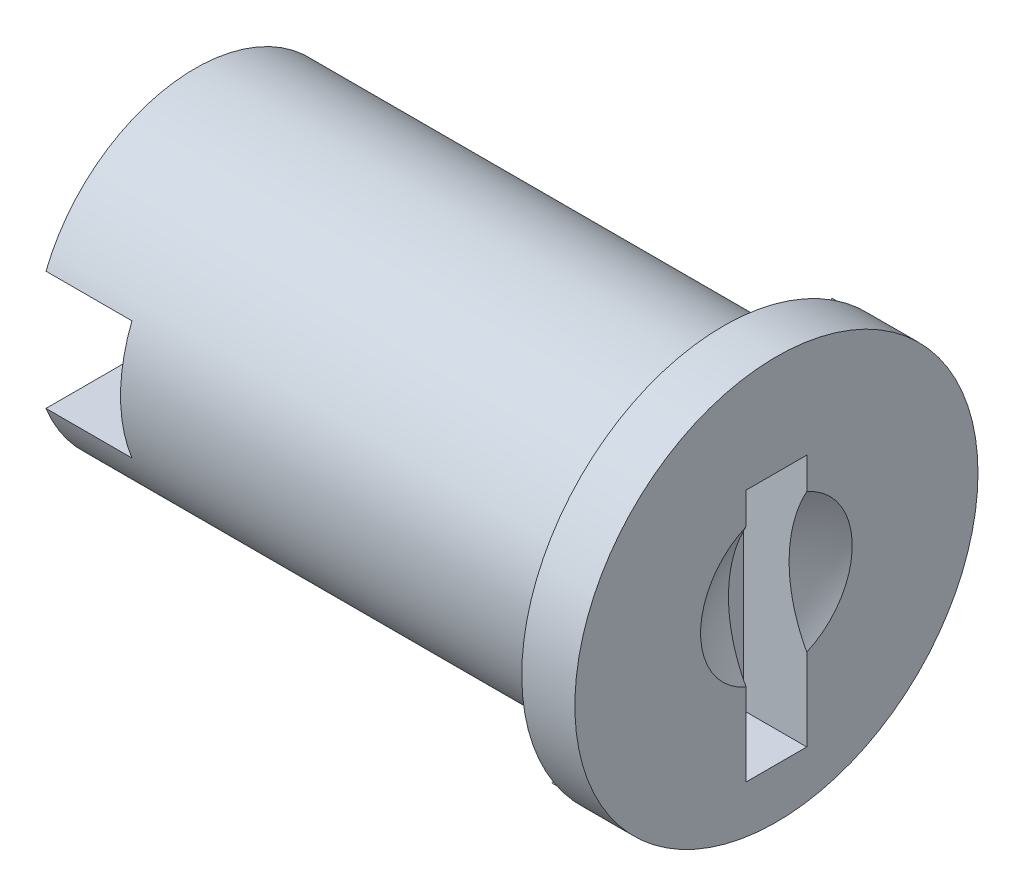
ISO-10303-21;
HEADER;
FILE_DESCRIPTION(('STEP AP214'),'2;1');
FILE_NAME('part.step','',(''),(''),'','','');
FILE_SCHEMA(('AUTOMOTIVE_DESIGN { 1 0 10303 214 1 1 1 1 }'));
ENDSEC;
DATA;
#1=APPLICATION_CONTEXT('core data for automotive mechanical design processes');
#2=APPLICATION_PROTOCOL_DEFINITION('international standard','automotive_design',2000,#1);
#3=PRODUCT_CONTEXT('',#1,'mechanical');
#4=PRODUCT('Part','Part','',(#3));
#5=PRODUCT_RELATED_PRODUCT_CATEGORY('part','',(#4));
#6=PRODUCT_DEFINITION_FORMATION('','',#4);
#7=PRODUCT_DEFINITION_CONTEXT('part definition',#1,'design');
#8=PRODUCT_DEFINITION('design','',#6,#7);
#9=PRODUCT_DEFINITION_SHAPE('','',#8);
#10=(LENGTH_UNIT() NAMED_UNIT(*) SI_UNIT(.MILLI.,.METRE.));
#11=(NAMED_UNIT(*) PLANE_ANGLE_UNIT() SI_UNIT($,.RADIAN.));
#12=(NAMED_UNIT(*) SI_UNIT($,.STERADIAN.) SOLID_ANGLE_UNIT());
#13=UNCERTAINTY_MEASURE_WITH_UNIT(LENGTH_MEASURE(1.E-05),#10,'distance_accuracy_value','');
#14=(GEOMETRIC_REPRESENTATION_CONTEXT(3) GLOBAL_UNCERTAINTY_ASSIGNED_CONTEXT((#13)) GLOBAL_UNIT_ASSIGNED_CONTEXT((#10,
#11,#12)) REPRESENTATION_CONTEXT('',''));
#15=CARTESIAN_POINT('',(0.,0.,0.));
#16=DIRECTION('',(0.,0.,1.));
#17=DIRECTION('',(1.,0.,0.));
#18=AXIS2_PLACEMENT_3D('',#15,#16,#17);
#19=CARTESIAN_POINT('',(61.725000000001,228.297576972466,13.339999964647));
#20=DIRECTION('',(-1.,0.,0.));
#21=DIRECTION('',(0.,0.,1.));
#22=AXIS2_PLACEMENT_3D('',#19,#20,#21);
#23=PLANE('',#22);
#24=DIRECTION('',(0.,0.,-1.));
#25=VECTOR('',#24,1.);
#26=CARTESIAN_POINT('',(61.725000000001,218.047577389513,13.4));
#27=LINE('',#26,#25);
#28=CARTESIAN_POINT('',(61.725000000001,218.047577389513,15.8));
#29=VERTEX_POINT('',#28);
#30=CARTESIAN_POINT('',(61.725000000001,218.047577389513,13.4));
#31=VERTEX_POINT('',#30);
#32=EDGE_CURVE('E281',#29,#31,#27,.T.);
#33=ORIENTED_EDGE('',*,*,#32,.T.);
#34=DIRECTION('',(0.,1.,0.));
#35=VECTOR('',#34,1.);
#36=CARTESIAN_POINT('',(61.725000000001,228.047577389513,13.4));
#37=LINE('',#36,#35);
#38=CARTESIAN_POINT('',(61.725000000001,228.047577389513,13.4));
#39=VERTEX_POINT('',#38);
#40=EDGE_CURVE('E136',#31,#39,#37,.T.);
#41=ORIENTED_EDGE('',*,*,#40,.T.);
#42=DIRECTION('',(0.,0.,1.));
#43=VECTOR('',#42,1.);
#44=CARTESIAN_POINT('',(61.725000000001,228.047577389513,15.8));
#45=LINE('',#44,#43);
#46=CARTESIAN_POINT('',(61.725000000001,228.047577389513,15.8));
#47=VERTEX_POINT('',#46);
#48=EDGE_CURVE('E135',#39,#47,#45,.T.);
#49=ORIENTED_EDGE('',*,*,#48,.T.);
#50=DIRECTION('',(0.,1.,0.));
#51=VECTOR('',#50,1.);
#52=CARTESIAN_POINT('',(61.725000000001,218.047577389513,15.8));
#53=LINE('',#52,#51);
#54=EDGE_CURVE('E123',#47,#29,#53,.F.);
#55=ORIENTED_EDGE('',*,*,#54,.T.);
#56=EDGE_LOOP('',(#33,#41,#49,#55));
#57=FACE_BOUND('',#56,.T.);
#58=ADVANCED_FACE('F15',(#57),#23,.F.);
#59=CARTESIAN_POINT('',(64.225000000001,218.047577389513,15.8));
#60=DIRECTION('',(0.,0.,1.));
#61=DIRECTION('',(1.,0.,0.));
#62=AXIS2_PLACEMENT_3D('',#59,#60,#61);
#63=PLANE('',#62);
#64=ORIENTED_EDGE('',*,*,#54,.F.);
#65=DIRECTION('',(1.,0.,0.));
#66=VECTOR('',#65,1.);
#67=CARTESIAN_POINT('',(64.225000000001,228.047577389513,15.8));
#68=LINE('',#67,#66);
#69=CARTESIAN_POINT('',(64.225000000001,228.047577389513,15.8));
#70=VERTEX_POINT('',#69);
#71=EDGE_CURVE('E127',#47,#70,#68,.T.);
#72=ORIENTED_EDGE('',*,*,#71,.T.);
#73=DIRECTION('',(0.,1.,0.));
#74=VECTOR('',#73,1.);
#75=CARTESIAN_POINT('',(64.225000000001,218.047577389513,15.8));
#76=LINE('',#75,#74);
#77=CARTESIAN_POINT('',(64.225000000001,226.797122806485,15.8));
#78=VERTEX_POINT('',#77);
#79=EDGE_CURVE('E97',#78,#70,#76,.T.);
#80=ORIENTED_EDGE('',*,*,#79,.F.);
#81=CARTESIAN_POINT('',(64.225000000001,226.797122806485,15.8));
#82=CARTESIAN_POINT('',(64.1476260516862,226.654266906512,15.8));
#83=CARTESIAN_POINT('',(64.0763126344508,226.508132131895,15.8));
#84=CARTESIAN_POINT('',(63.9462470484049,226.210382969737,15.8));
#85=CARTESIAN_POINT('',(63.8874943173034,226.05876882784,15.8));
#86=CARTESIAN_POINT('',(63.7830562351237,225.751340828581,15.8));
#87=CARTESIAN_POINT('',(63.7373527555412,225.595533129826,15.8));
#88=CARTESIAN_POINT('',(63.6592239316829,225.280626356045,15.8));
#89=CARTESIAN_POINT('',(63.6267983631208,225.121527336663,15.8));
#90=CARTESIAN_POINT('',(63.5754413767709,224.801074240794,15.8));
#91=CARTESIAN_POINT('',(63.5565175543076,224.639718947006,15.8));
#92=CARTESIAN_POINT('',(63.5323223458392,224.315913378693,15.8));
#93=CARTESIAN_POINT('',(63.5270572244651,224.153462635972,15.8));
#94=CARTESIAN_POINT('',(63.5302346401712,223.828716941676,15.8));
#95=CARTESIAN_POINT('',(63.5386754064599,223.666421972688,15.8));
#96=CARTESIAN_POINT('',(63.5691947373494,223.3431945374,15.8));
#97=CARTESIAN_POINT('',(63.5912668327526,223.182261461474,15.8));
#98=CARTESIAN_POINT('',(63.6472101218361,222.872111604443,15.8));
#99=CARTESIAN_POINT('',(63.6803215481411,222.722757224128,15.8));
#100=CARTESIAN_POINT('',(63.7582867523674,222.427149176738,15.8));
#101=CARTESIAN_POINT('',(63.8031400731256,222.280895389183,15.8));
#102=CARTESIAN_POINT('',(63.904361618914,221.992263818947,15.8));
#103=CARTESIAN_POINT('',(63.9607413764862,221.849890081331,15.8));
#104=CARTESIAN_POINT('',(64.0846222899037,221.570052183648,15.8));
#105=CARTESIAN_POINT('',(64.1521243788181,221.432588436666,15.8));
#106=CARTESIAN_POINT('',(64.225000000001,221.29803197254,15.8));
#107=B_SPLINE_CURVE_WITH_KNOTS('',3,(#81,#82,#83,#84,#85,#86,#87,#88,#89,#90,#91,#92,#93,#94,
#95,#96,#97,#98,#99,#100,#101,#102,#103,#104,#105,#106),.UNSPECIFIED.,.F.,.F.,(4,2,2,2,2,2,2,2,
2,2,2,2,4),(0.,0.487243090755689,0.974464365040759,1.4610054429311,1.94753830198386,
2.43434464177392,2.9213742182606,3.40834087585714,3.89507660474472,4.35354203632693,
4.81198962050202,5.27089815982529,5.72984521729627),.UNSPECIFIED.);
#108=CARTESIAN_POINT('',(64.225000000001,221.29803197254,15.8));
#109=VERTEX_POINT('',#108);
#110=EDGE_CURVE('E18',#78,#109,#107,.T.);
#111=ORIENTED_EDGE('',*,*,#110,.T.);
#112=DIRECTION('',(0.,1.,0.));
#113=VECTOR('',#112,1.);
#114=CARTESIAN_POINT('',(64.225000000001,232.421326998804,15.8));
#115=LINE('',#114,#113);
#116=CARTESIAN_POINT('',(64.225000000001,218.047577389513,15.8));
#117=VERTEX_POINT('',#116);
#118=EDGE_CURVE('E106',#117,#109,#115,.T.);
#119=ORIENTED_EDGE('',*,*,#118,.F.);
#120=DIRECTION('',(1.,0.,0.));
#121=VECTOR('',#120,1.);
#122=CARTESIAN_POINT('',(64.225000000001,218.047577389513,15.8));
#123=LINE('',#122,#121);
#124=EDGE_CURVE('E129',#117,#29,#123,.F.);
#125=ORIENTED_EDGE('',*,*,#124,.T.);
#126=EDGE_LOOP('',(#64,#72,#80,#111,#119,#125));
#127=FACE_BOUND('',#126,.T.);
#128=ADVANCED_FACE('F125',(#127),#63,.F.);
#129=CARTESIAN_POINT('',(69.3028048780479,224.047577389513,14.6));
#130=DIRECTION('',(1.,0.,0.));
#131=DIRECTION('',(0.,1.,0.));
#132=AXIS2_PLACEMENT_3D('',#129,#130,#131);
#133=SPHERICAL_SURFACE('',#132,5.89780487804667);
#134=ORIENTED_EDGE('',*,*,#110,.F.);
#135=CARTESIAN_POINT('',(64.225000000001,224.047577389513,14.6));
#136=DIRECTION('',(1.,0.,0.));
#137=DIRECTION('',(0.,0.,-1.));
#138=AXIS2_PLACEMENT_3D('',#135,#136,#137);
#139=CIRCLE('',#138,2.99999999999914);
#140=EDGE_CURVE('E233',#109,#78,#139,.F.);
#141=ORIENTED_EDGE('',*,*,#140,.F.);
#142=EDGE_LOOP('',(#134,#141));
#143=FACE_BOUND('',#142,.T.);
#144=ADVANCED_FACE('F154',(#143),#133,.F.);
#145=CARTESIAN_POINT('',(64.225000000001,228.047577389513,15.8));
#146=DIRECTION('',(0.,1.,0.));
#147=DIRECTION('',(0.,0.,1.));
#148=AXIS2_PLACEMENT_3D('',#145,#146,#147);
#149=PLANE('',#148);
#150=DIRECTION('',(-1.,0.,0.));
#151=VECTOR('',#150,1.);
#152=CARTESIAN_POINT('',(64.225000000001,228.047577389513,13.4));
#153=LINE('',#152,#151);
#154=CARTESIAN_POINT('',(64.225000000001,228.047577389513,13.4));
#155=VERTEX_POINT('',#154);
#156=EDGE_CURVE('E278',#39,#155,#153,.F.);
#157=ORIENTED_EDGE('',*,*,#156,.T.);
#158=DIRECTION('',(0.,0.,-1.));
#159=VECTOR('',#158,1.);
#160=CARTESIAN_POINT('',(64.225000000001,228.047577389513,22.9737498044968));
#161=LINE('',#160,#159);
#162=EDGE_CURVE('E143',#70,#155,#161,.T.);
#163=ORIENTED_EDGE('',*,*,#162,.F.);
#164=ORIENTED_EDGE('',*,*,#71,.F.);
#165=ORIENTED_EDGE('',*,*,#48,.F.);
#166=EDGE_LOOP('',(#157,#163,#164,#165));
#167=FACE_BOUND('',#166,.T.);
#168=ADVANCED_FACE('F141',(#167),#149,.F.);
#169=CARTESIAN_POINT('',(69.3028048780479,224.047577389513,14.6));
#170=DIRECTION('',(1.,0.,0.));
#171=DIRECTION('',(0.,1.,0.));
#172=AXIS2_PLACEMENT_3D('',#169,#170,#171);
#173=SPHERICAL_SURFACE('',#172,5.89780487804667);
#174=CARTESIAN_POINT('',(64.225000000001,226.797122806485,13.4));
#175=CARTESIAN_POINT('',(64.1476260516861,226.654266906512,13.4));
#176=CARTESIAN_POINT('',(64.0763126344507,226.508132131895,13.4));
#177=CARTESIAN_POINT('',(63.9462470484049,226.210382969737,13.4));
#178=CARTESIAN_POINT('',(63.8874943173034,226.05876882784,13.4));
#179=CARTESIAN_POINT('',(63.7830562351237,225.751340828581,13.4));
#180=CARTESIAN_POINT('',(63.7373527555412,225.595533129826,13.4));
#181=CARTESIAN_POINT('',(63.6592239316828,225.280626356045,13.4));
#182=CARTESIAN_POINT('',(63.6267983631207,225.121527336663,13.4));
#183=CARTESIAN_POINT('',(63.5754413767709,224.801074240794,13.4));
#184=CARTESIAN_POINT('',(63.5565175543076,224.639718947006,13.4));
#185=CARTESIAN_POINT('',(63.5323223458392,224.315913378693,13.4));
#186=CARTESIAN_POINT('',(63.5270572244651,224.153462635972,13.4));
#187=CARTESIAN_POINT('',(63.5302346401712,223.828716941676,13.4));
#188=CARTESIAN_POINT('',(63.5386754064599,223.666421972688,13.4));
#189=CARTESIAN_POINT('',(63.5691947373494,223.3431945374,13.4));
#190=CARTESIAN_POINT('',(63.5912668327526,223.182261461474,13.4));
#191=CARTESIAN_POINT('',(63.6472101218361,222.872111604443,13.4));
#192=CARTESIAN_POINT('',(63.6803215481411,222.722757224128,13.4));
#193=CARTESIAN_POINT('',(63.7582867523674,222.427149176738,13.4));
#194=CARTESIAN_POINT('',(63.8031400731256,222.280895389183,13.4));
#195=CARTESIAN_POINT('',(63.904361618914,221.992263818947,13.4));
#196=CARTESIAN_POINT('',(63.9607413764862,221.849890081331,13.4));
#197=CARTESIAN_POINT('',(64.0846222899037,221.570052183648,13.4));
#198=CARTESIAN_POINT('',(64.1521243788181,221.432588436666,13.4));
#199=CARTESIAN_POINT('',(64.225000000001,221.29803197254,13.4));
#200=B_SPLINE_CURVE_WITH_KNOTS('',3,(#174,#175,#176,#177,#178,#179,#180,#181,#182,#183,#184,
#185,#186,#187,#188,#189,#190,#191,#192,#193,#194,#195,#196,#197,#198,#199),.UNSPECIFIED.,.F.,
.F.,(4,2,2,2,2,2,2,2,2,2,2,2,4),(0.,0.487243090755695,0.97446436504076,1.46100544293113,
1.94753830198389,2.43434464177395,2.92137421826062,3.4083408758572,3.89507660474475,
4.35354203632693,4.81198962050204,5.27089815982529,5.72984521729626),.UNSPECIFIED.);
#201=CARTESIAN_POINT('',(64.225000000001,226.797122806485,13.4));
#202=VERTEX_POINT('',#201);
#203=CARTESIAN_POINT('',(64.225000000001,221.29803197254,13.4));
#204=VERTEX_POINT('',#203);
#205=EDGE_CURVE('E139',#202,#204,#200,.T.);
#206=ORIENTED_EDGE('',*,*,#205,.T.);
#207=CARTESIAN_POINT('',(64.225000000001,224.047577389513,14.6));
#208=DIRECTION('',(1.,0.,0.));
#209=DIRECTION('',(0.,0.,-1.));
#210=AXIS2_PLACEMENT_3D('',#207,#208,#209);
#211=CIRCLE('',#210,2.99999999999915);
#212=EDGE_CURVE('E236',#202,#204,#211,.F.);
#213=ORIENTED_EDGE('',*,*,#212,.F.);
#214=EDGE_LOOP('',(#206,#213));
#215=FACE_BOUND('',#214,.T.);
#216=ADVANCED_FACE('F225',(#215),#173,.F.);
#217=CARTESIAN_POINT('',(64.225000000001,228.047577389513,13.4));
#218=DIRECTION('',(0.,0.,-1.));
#219=DIRECTION('',(-1.,0.,0.));
#220=AXIS2_PLACEMENT_3D('',#217,#218,#219);
#221=PLANE('',#220);
#222=ORIENTED_EDGE('',*,*,#40,.F.);
#223=DIRECTION('',(1.,0.,0.));
#224=VECTOR('',#223,1.);
#225=CARTESIAN_POINT('',(64.225000000001,218.047577389513,13.4));
#226=LINE('',#225,#224);
#227=CARTESIAN_POINT('',(64.225000000001,218.047577389513,13.4));
#228=VERTEX_POINT('',#227);
#229=EDGE_CURVE('E287',#31,#228,#226,.T.);
#230=ORIENTED_EDGE('',*,*,#229,.T.);
#231=DIRECTION('',(0.,1.,0.));
#232=VECTOR('',#231,1.);
#233=CARTESIAN_POINT('',(64.225000000001,232.421326998804,13.4));
#234=LINE('',#233,#232);
#235=EDGE_CURVE('E239',#204,#228,#234,.F.);
#236=ORIENTED_EDGE('',*,*,#235,.F.);
#237=ORIENTED_EDGE('',*,*,#205,.F.);
#238=DIRECTION('',(0.,1.,0.));
#239=VECTOR('',#238,1.);
#240=CARTESIAN_POINT('',(64.225000000001,232.421326998804,13.4));
#241=LINE('',#240,#239);
#242=EDGE_CURVE('E240',#155,#202,#241,.F.);
#243=ORIENTED_EDGE('',*,*,#242,.F.);
#244=ORIENTED_EDGE('',*,*,#156,.F.);
#245=EDGE_LOOP('',(#222,#230,#236,#237,#243,#244));
#246=FACE_BOUND('',#245,.T.);
#247=ADVANCED_FACE('F221',(#246),#221,.F.);
#248=CARTESIAN_POINT('',(64.225000000001,218.047577389513,13.4));
#249=DIRECTION('',(0.,-1.,0.));
#250=DIRECTION('',(0.,0.,-1.));
#251=AXIS2_PLACEMENT_3D('',#248,#249,#250);
#252=PLANE('',#251);
#253=ORIENTED_EDGE('',*,*,#124,.F.);
#254=DIRECTION('',(0.,0.,-1.));
#255=VECTOR('',#254,1.);
#256=CARTESIAN_POINT('',(64.225000000001,218.047577389513,22.9737498044968));
#257=LINE('',#256,#255);
#258=EDGE_CURVE('E245',#228,#117,#257,.F.);
#259=ORIENTED_EDGE('',*,*,#258,.F.);
#260=ORIENTED_EDGE('',*,*,#229,.F.);
#261=ORIENTED_EDGE('',*,*,#32,.F.);
#262=EDGE_LOOP('',(#253,#259,#260,#261));
#263=FACE_BOUND('',#262,.T.);
#264=ADVANCED_FACE('F217',(#263),#252,.F.);
#265=CARTESIAN_POINT('',(64.225000000001,232.421326998804,22.9737498044968));
#266=DIRECTION('',(1.,0.,0.));
#267=DIRECTION('',(0.,0.,-1.));
#268=AXIS2_PLACEMENT_3D('',#265,#266,#267);
#269=PLANE('',#268);
#270=ORIENTED_EDGE('',*,*,#235,.T.);
#271=ORIENTED_EDGE('',*,*,#258,.T.);
#272=ORIENTED_EDGE('',*,*,#118,.T.);
#273=ORIENTED_EDGE('',*,*,#140,.T.);
#274=ORIENTED_EDGE('',*,*,#79,.T.);
#275=ORIENTED_EDGE('',*,*,#162,.T.);
#276=ORIENTED_EDGE('',*,*,#242,.T.);
#277=ORIENTED_EDGE('',*,*,#212,.T.);
#278=EDGE_LOOP('',(#270,#271,#272,#273,#274,#275,#276,#277));
#279=FACE_BOUND('',#278,.T.);
#280=CARTESIAN_POINT('',(64.225000000001,224.047577389513,14.6));
#281=DIRECTION('',(1.,0.,0.));
#282=DIRECTION('',(0.,0.,-1.));
#283=AXIS2_PLACEMENT_3D('',#280,#281,#282);
#284=CIRCLE('',#283,7.975);
#285=CARTESIAN_POINT('',(64.225000000001,224.047577389513,6.62500000000001));
#286=VERTEX_POINT('',#285);
#287=EDGE_CURVE('E241',#286,#286,#284,.F.);
#288=ORIENTED_EDGE('',*,*,#287,.F.);
#289=EDGE_LOOP('',(#288));
#290=FACE_BOUND('',#289,.T.);
#291=ADVANCED_FACE('F213',(#279,#290),#269,.T.);
#292=CARTESIAN_POINT('',(58.825000000001,224.047577389513,14.6));
#293=DIRECTION('',(1.,0.,0.));
#294=DIRECTION('',(0.,0.,-1.));
#295=AXIS2_PLACEMENT_3D('',#292,#293,#294);
#296=CYLINDRICAL_SURFACE('',#295,7.975);
#297=ORIENTED_EDGE('',*,*,#287,.T.);
#298=EDGE_LOOP('',(#297));
#299=FACE_BOUND('',#298,.T.);
#300=CARTESIAN_POINT('',(62.125000000001,224.047577389513,14.6));
#301=DIRECTION('',(1.,0.,0.));
#302=DIRECTION('',(0.,0.,-1.));
#303=AXIS2_PLACEMENT_3D('',#300,#301,#302);
#304=CIRCLE('',#303,7.975);
#305=CARTESIAN_POINT('',(62.125000000001,228.525447031682,8.00081001427133));
#306=VERTEX_POINT('',#305);
#307=CARTESIAN_POINT('',(62.125000000001,217.448387403784,19.077869642169));
#308=VERTEX_POINT('',#307);
#309=EDGE_CURVE('E244',#306,#308,#304,.T.);
#310=ORIENTED_EDGE('',*,*,#309,.T.);
#311=DIRECTION('',(1.,0.,0.));
#312=VECTOR('',#311,1.);
#313=CARTESIAN_POINT('',(59.825000000001,217.448387403784,19.077869642169));
#314=LINE('',#313,#312);
#315=CARTESIAN_POINT('',(59.825000000001,217.448387403784,19.077869642169));
#316=VERTEX_POINT('',#315);
#317=EDGE_CURVE('E317',#308,#316,#314,.F.);
#318=ORIENTED_EDGE('',*,*,#317,.T.);
#319=CARTESIAN_POINT('',(59.825000000001,224.047577389513,14.6));
#320=DIRECTION('',(1.,0.,0.));
#321=DIRECTION('',(0.,0.,-1.));
#322=AXIS2_PLACEMENT_3D('',#319,#320,#321);
#323=CIRCLE('',#322,7.975);
#324=CARTESIAN_POINT('',(59.825000000001,228.525447031682,8.00081001427133));
#325=VERTEX_POINT('',#324);
#326=EDGE_CURVE('E248',#316,#325,#323,.T.);
#327=ORIENTED_EDGE('',*,*,#326,.T.);
#328=DIRECTION('',(1.,0.,0.));
#329=VECTOR('',#328,1.);
#330=CARTESIAN_POINT('',(59.825000000001,228.525447031682,8.00081001427136));
#331=LINE('',#330,#329);
#332=EDGE_CURVE('E247',#325,#306,#331,.T.);
#333=ORIENTED_EDGE('',*,*,#332,.T.);
#334=EDGE_LOOP('',(#310,#318,#327,#333));
#335=FACE_BOUND('',#334,.T.);
#336=ADVANCED_FACE('F209',(#299,#335),#296,.T.);
#337=CARTESIAN_POINT('',(62.1250000000011,217.084032681954,22.9393547812477));
#338=DIRECTION('',(1.,0.,0.));
#339=DIRECTION('',(0.,0.,-1.));
#340=AXIS2_PLACEMENT_3D('',#337,#338,#339);
#341=PLANE('',#340);
#342=DIRECTION('',(0.,0.707106781186552,-0.707106781186543));
#343=VECTOR('',#342,1.);
#344=CARTESIAN_POINT('',(62.125000000001,217.448387403784,19.077869642169));
#345=LINE('',#344,#343);
#346=CARTESIAN_POINT('',(62.125000000001,218.623862095459,17.9023949504939));
#347=VERTEX_POINT('',#346);
#348=EDGE_CURVE('E320',#347,#308,#345,.F.);
#349=ORIENTED_EDGE('',*,*,#348,.T.);
#350=ORIENTED_EDGE('',*,*,#309,.F.);
#351=DIRECTION('',(0.,0.707106781186525,-0.70710678118657));
#352=VECTOR('',#351,1.);
#353=CARTESIAN_POINT('',(62.125000000001,227.349972340007,9.17628470594638));
#354=LINE('',#353,#352);
#355=CARTESIAN_POINT('',(62.125000000001,227.349972340007,9.17628470594623));
#356=VERTEX_POINT('',#355);
#357=EDGE_CURVE('E251',#306,#356,#354,.F.);
#358=ORIENTED_EDGE('',*,*,#357,.T.);
#359=CARTESIAN_POINT('',(62.125000000001,224.047577389513,14.5999999999999));
#360=DIRECTION('',(-1.,0.,0.));
#361=DIRECTION('',(0.,0.,1.));
#362=AXIS2_PLACEMENT_3D('',#359,#360,#361);
#363=CIRCLE('',#362,6.35000000000001);
#364=EDGE_CURVE('E252',#347,#356,#363,.T.);
#365=ORIENTED_EDGE('',*,*,#364,.F.);
#366=EDGE_LOOP('',(#349,#350,#358,#365));
#367=FACE_BOUND('',#366,.T.);
#368=ADVANCED_FACE('F205',(#367),#341,.F.);
#369=CARTESIAN_POINT('',(59.825000000001,227.349972340007,9.17628470594638));
#370=DIRECTION('',(0.,-0.70710678118657,-0.707106781186525));
#371=DIRECTION('',(0.,0.707106781186525,-0.70710678118657));
#372=AXIS2_PLACEMENT_3D('',#369,#370,#371);
#373=PLANE('',#372);
#374=ORIENTED_EDGE('',*,*,#332,.F.);
#375=DIRECTION('',(0.,-0.707106781186584,0.707106781186511));
#376=VECTOR('',#375,1.);
#377=CARTESIAN_POINT('',(59.825000000001,228.525447031682,8.00081001427136));
#378=LINE('',#377,#376);
#379=CARTESIAN_POINT('',(59.825000000001,227.349972340007,9.17628470594619));
#380=VERTEX_POINT('',#379);
#381=EDGE_CURVE('E250',#325,#380,#378,.T.);
#382=ORIENTED_EDGE('',*,*,#381,.T.);
#383=DIRECTION('',(-1.,0.,0.));
#384=VECTOR('',#383,1.);
#385=CARTESIAN_POINT('',(62.325000000001,227.349972340007,9.17628470594619));
#386=LINE('',#385,#384);
#387=EDGE_CURVE('E255',#356,#380,#386,.T.);
#388=ORIENTED_EDGE('',*,*,#387,.F.);
#389=ORIENTED_EDGE('',*,*,#357,.F.);
#390=EDGE_LOOP('',(#374,#382,#388,#389));
#391=FACE_BOUND('',#390,.T.);
#392=ADVANCED_FACE('F201',(#391),#373,.F.);
#393=CARTESIAN_POINT('',(59.825000000001,229.525447031682,4.93123907987029));
#394=DIRECTION('',(1.,0.,0.));
#395=DIRECTION('',(0.,0.,-1.));
#396=AXIS2_PLACEMENT_3D('',#393,#394,#395);
#397=PLANE('',#396);
#398=ORIENTED_EDGE('',*,*,#326,.F.);
#399=DIRECTION('',(0.,0.707106781186552,-0.707106781186543));
#400=VECTOR('',#399,1.);
#401=CARTESIAN_POINT('',(59.825000000001,217.448387403784,19.077869642169));
#402=LINE('',#401,#400);
#403=CARTESIAN_POINT('',(59.825000000001,218.623862095459,17.9023949504939));
#404=VERTEX_POINT('',#403);
#405=EDGE_CURVE('E319',#316,#404,#402,.T.);
#406=ORIENTED_EDGE('',*,*,#405,.T.);
#407=CARTESIAN_POINT('',(59.825000000001,224.047577389513,14.5999999999999));
#408=DIRECTION('',(-1.,0.,0.));
#409=DIRECTION('',(0.,0.,1.));
#410=AXIS2_PLACEMENT_3D('',#407,#408,#409);
#411=CIRCLE('',#410,6.35000000000001);
#412=EDGE_CURVE('E256',#380,#404,#411,.T.);
#413=ORIENTED_EDGE('',*,*,#412,.F.);
#414=ORIENTED_EDGE('',*,*,#381,.F.);
#415=EDGE_LOOP('',(#398,#406,#413,#414));
#416=FACE_BOUND('',#415,.T.);
#417=ADVANCED_FACE('F197',(#416),#397,.F.);
#418=CARTESIAN_POINT('',(59.825000000001,217.448387403784,19.077869642169));
#419=DIRECTION('',(0.,-0.707106781186543,-0.707106781186552));
#420=DIRECTION('',(0.,0.707106781186552,-0.707106781186543));
#421=AXIS2_PLACEMENT_3D('',#418,#419,#420);
#422=PLANE('',#421);
#423=DIRECTION('',(-1.,0.,0.));
#424=VECTOR('',#423,1.);
#425=CARTESIAN_POINT('',(62.325000000001,218.623862095459,17.902394950494));
#426=LINE('',#425,#424);
#427=EDGE_CURVE('E259',#404,#347,#426,.F.);
#428=ORIENTED_EDGE('',*,*,#427,.F.);
#429=ORIENTED_EDGE('',*,*,#405,.F.);
#430=ORIENTED_EDGE('',*,*,#317,.F.);
#431=ORIENTED_EDGE('',*,*,#348,.F.);
#432=EDGE_LOOP('',(#428,#429,#430,#431));
#433=FACE_BOUND('',#432,.T.);
#434=ADVANCED_FACE('F193',(#433),#422,.F.);
#435=CARTESIAN_POINT('',(41.225000000001,217.597577453774,20.7941095756367));
#436=DIRECTION('',(-1.,0.,0.));
#437=DIRECTION('',(0.,0.,1.));
#438=AXIS2_PLACEMENT_3D('',#435,#436,#437);
#439=PLANE('',#438);
#440=CARTESIAN_POINT('',(41.225000000001,224.047577389513,14.5999999999999));
#441=DIRECTION('',(-1.,0.,0.));
#442=DIRECTION('',(0.,0.,1.));
#443=AXIS2_PLACEMENT_3D('',#440,#441,#442);
#444=CIRCLE('',#443,6.35000000000001);
#445=CARTESIAN_POINT('',(41.225000000001,221.697577389513,20.499152481501));
#446=VERTEX_POINT('',#445);
#447=CARTESIAN_POINT('',(41.225000000001,221.697577389513,8.70084751849888));
#448=VERTEX_POINT('',#447);
#449=EDGE_CURVE('E264',#446,#448,#444,.F.);
#450=ORIENTED_EDGE('',*,*,#449,.F.);
#451=DIRECTION('',(0.,0.,1.));
#452=VECTOR('',#451,1.);
#453=CARTESIAN_POINT('',(41.225000000001,221.697577389513,20.4991524815011));
#454=LINE('',#453,#452);
#455=EDGE_CURVE('E323',#448,#446,#454,.T.);
#456=ORIENTED_EDGE('',*,*,#455,.F.);
#457=EDGE_LOOP('',(#450,#456));
#458=FACE_BOUND('',#457,.T.);
#459=ADVANCED_FACE('F189',(#458),#439,.T.);
#460=CARTESIAN_POINT('',(44.625000000001,221.697577389513,20.4991524815011));
#461=DIRECTION('',(0.,1.,0.));
#462=DIRECTION('',(0.,0.,1.));
#463=AXIS2_PLACEMENT_3D('',#460,#461,#462);
#464=PLANE('',#463);
#465=DIRECTION('',(-1.,0.,0.));
#466=VECTOR('',#465,1.);
#467=CARTESIAN_POINT('',(62.325000000001,221.697577389513,8.70084751849888));
#468=LINE('',#467,#466);
#469=CARTESIAN_POINT('',(44.625000000001,221.697577389513,8.70084751849891));
#470=VERTEX_POINT('',#469);
#471=EDGE_CURVE('E267',#448,#470,#468,.F.);
#472=ORIENTED_EDGE('',*,*,#471,.F.);
#473=ORIENTED_EDGE('',*,*,#455,.T.);
#474=DIRECTION('',(-1.,0.,0.));
#475=VECTOR('',#474,1.);
#476=CARTESIAN_POINT('',(62.325000000001,221.697577389513,20.499152481501));
#477=LINE('',#476,#475);
#478=CARTESIAN_POINT('',(44.625000000001,221.697577389513,20.499152481501));
#479=VERTEX_POINT('',#478);
#480=EDGE_CURVE('E263',#479,#446,#477,.T.);
#481=ORIENTED_EDGE('',*,*,#480,.F.);
#482=DIRECTION('',(0.,0.,1.));
#483=VECTOR('',#482,1.);
#484=CARTESIAN_POINT('',(44.625000000001,221.697577389513,6.22625022120775));
#485=LINE('',#484,#483);
#486=EDGE_CURVE('E334',#470,#479,#485,.T.);
#487=ORIENTED_EDGE('',*,*,#486,.F.);
#488=EDGE_LOOP('',(#472,#473,#481,#487));
#489=FACE_BOUND('',#488,.T.);
#490=ADVANCED_FACE('F185',(#489),#464,.T.);
#491=CARTESIAN_POINT('',(44.625000000001,220.697577389513,6.22625022120775));
#492=DIRECTION('',(-1.,0.,0.));
#493=DIRECTION('',(0.,0.,1.));
#494=AXIS2_PLACEMENT_3D('',#491,#492,#493);
#495=PLANE('',#494);
#496=CARTESIAN_POINT('',(44.625000000001,224.047577389513,14.5999999999999));
#497=DIRECTION('',(-1.,0.,0.));
#498=DIRECTION('',(0.,0.,1.));
#499=AXIS2_PLACEMENT_3D('',#496,#497,#498);
#500=CIRCLE('',#499,6.35000000000001);
#501=CARTESIAN_POINT('',(44.625000000001,226.397577389513,8.70084751849889));
#502=VERTEX_POINT('',#501);
#503=EDGE_CURVE('E268',#470,#502,#500,.F.);
#504=ORIENTED_EDGE('',*,*,#503,.F.);
#505=ORIENTED_EDGE('',*,*,#486,.T.);
#506=CARTESIAN_POINT('',(44.625000000001,224.047577389513,14.5999999999999));
#507=DIRECTION('',(-1.,0.,0.));
#508=DIRECTION('',(0.,0.,1.));
#509=AXIS2_PLACEMENT_3D('',#506,#507,#508);
#510=CIRCLE('',#509,6.35000000000001);
#511=CARTESIAN_POINT('',(44.625000000001,226.397577389513,20.499152481501));
#512=VERTEX_POINT('',#511);
#513=EDGE_CURVE('E260',#512,#479,#510,.F.);
#514=ORIENTED_EDGE('',*,*,#513,.F.);
#515=DIRECTION('',(0.,0.,-1.));
#516=VECTOR('',#515,1.);
#517=CARTESIAN_POINT('',(44.625000000001,226.397577389513,8.70084751849902));
#518=LINE('',#517,#516);
#519=EDGE_CURVE('E338',#502,#512,#518,.F.);
#520=ORIENTED_EDGE('',*,*,#519,.F.);
#521=EDGE_LOOP('',(#504,#505,#514,#520));
#522=FACE_BOUND('',#521,.T.);
#523=ADVANCED_FACE('F182',(#522),#495,.T.);
#524=CARTESIAN_POINT('',(41.225000000001,226.297577575964,20.7941095756367));
#525=DIRECTION('',(-1.,0.,0.));
#526=DIRECTION('',(0.,0.,1.));
#527=AXIS2_PLACEMENT_3D('',#524,#525,#526);
#528=PLANE('',#527);
#529=DIRECTION('',(0.,0.,-1.));
#530=VECTOR('',#529,1.);
#531=CARTESIAN_POINT('',(41.225000000001,226.397577389513,8.70084751849902));
#532=LINE('',#531,#530);
#533=CARTESIAN_POINT('',(41.225000000001,226.397577389513,20.499152481501));
#534=VERTEX_POINT('',#533);
#535=CARTESIAN_POINT('',(41.225000000001,226.397577389513,8.70084751849889));
#536=VERTEX_POINT('',#535);
#537=EDGE_CURVE('E36',#534,#536,#532,.T.);
#538=ORIENTED_EDGE('',*,*,#537,.F.);
#539=CARTESIAN_POINT('',(41.225000000001,224.047577389513,14.5999999999999));
#540=DIRECTION('',(-1.,0.,0.));
#541=DIRECTION('',(0.,0.,1.));
#542=AXIS2_PLACEMENT_3D('',#539,#540,#541);
#543=CIRCLE('',#542,6.35000000000001);
#544=EDGE_CURVE('E28',#536,#534,#543,.F.);
#545=ORIENTED_EDGE('',*,*,#544,.F.);
#546=EDGE_LOOP('',(#538,#545));
#547=FACE_BOUND('',#546,.T.);
#548=ADVANCED_FACE('F174',(#547),#528,.T.);
#549=CARTESIAN_POINT('',(44.625000000001,226.397577389513,8.70084751849902));
#550=DIRECTION('',(0.,-1.,0.));
#551=DIRECTION('',(0.,0.,-1.));
#552=AXIS2_PLACEMENT_3D('',#549,#550,#551);
#553=PLANE('',#552);
#554=DIRECTION('',(-1.,0.,0.));
#555=VECTOR('',#554,1.);
#556=CARTESIAN_POINT('',(62.325000000001,226.397577389513,20.499152481501));
#557=LINE('',#556,#555);
#558=EDGE_CURVE('E10',#534,#512,#557,.F.);
#559=ORIENTED_EDGE('',*,*,#558,.F.);
#560=ORIENTED_EDGE('',*,*,#537,.T.);
#561=DIRECTION('',(-1.,0.,0.));
#562=VECTOR('',#561,1.);
#563=CARTESIAN_POINT('',(62.325000000001,226.397577389513,8.70084751849893));
#564=LINE('',#563,#562);
#565=EDGE_CURVE('E271',#502,#536,#564,.T.);
#566=ORIENTED_EDGE('',*,*,#565,.F.);
#567=ORIENTED_EDGE('',*,*,#519,.T.);
#568=EDGE_LOOP('',(#559,#560,#566,#567));
#569=FACE_BOUND('',#568,.T.);
#570=ADVANCED_FACE('F168',(#569),#553,.T.);
#571=CARTESIAN_POINT('',(62.325000000001,224.047577389513,14.5999999999999));
#572=DIRECTION('',(-1.,0.,0.));
#573=DIRECTION('',(0.,0.,1.));
#574=AXIS2_PLACEMENT_3D('',#571,#572,#573);
#575=CYLINDRICAL_SURFACE('',#574,6.35000000000001);
#576=ORIENTED_EDGE('',*,*,#544,.T.);
#577=ORIENTED_EDGE('',*,*,#558,.T.);
#578=ORIENTED_EDGE('',*,*,#513,.T.);
#579=ORIENTED_EDGE('',*,*,#480,.T.);
#580=ORIENTED_EDGE('',*,*,#449,.T.);
#581=ORIENTED_EDGE('',*,*,#471,.T.);
#582=ORIENTED_EDGE('',*,*,#503,.T.);
#583=ORIENTED_EDGE('',*,*,#565,.T.);
#584=EDGE_LOOP('',(#576,#577,#578,#579,#580,#581,#582,#583));
#585=FACE_BOUND('',#584,.T.);
#586=ORIENTED_EDGE('',*,*,#412,.T.);
#587=ORIENTED_EDGE('',*,*,#427,.T.);
#588=ORIENTED_EDGE('',*,*,#364,.T.);
#589=ORIENTED_EDGE('',*,*,#387,.T.);
#590=EDGE_LOOP('',(#586,#587,#588,#589));
#591=FACE_BOUND('',#590,.T.);
#592=ADVANCED_FACE('F166',(#585,#591),#575,.T.);
#593=CLOSED_SHELL('',(#58,#128,#144,#168,#216,#247,#264,#291,#336,#368,#392,#417,#434,#459,#490,
#523,#548,#570,#592));
#594=MANIFOLD_SOLID_BREP('B1',#593);
#595=ADVANCED_BREP_SHAPE_REPRESENTATION('',(#18,#594),#14);
#596=SHAPE_DEFINITION_REPRESENTATION(#9,#595);
ENDSEC;
END-ISO-10303-21;
